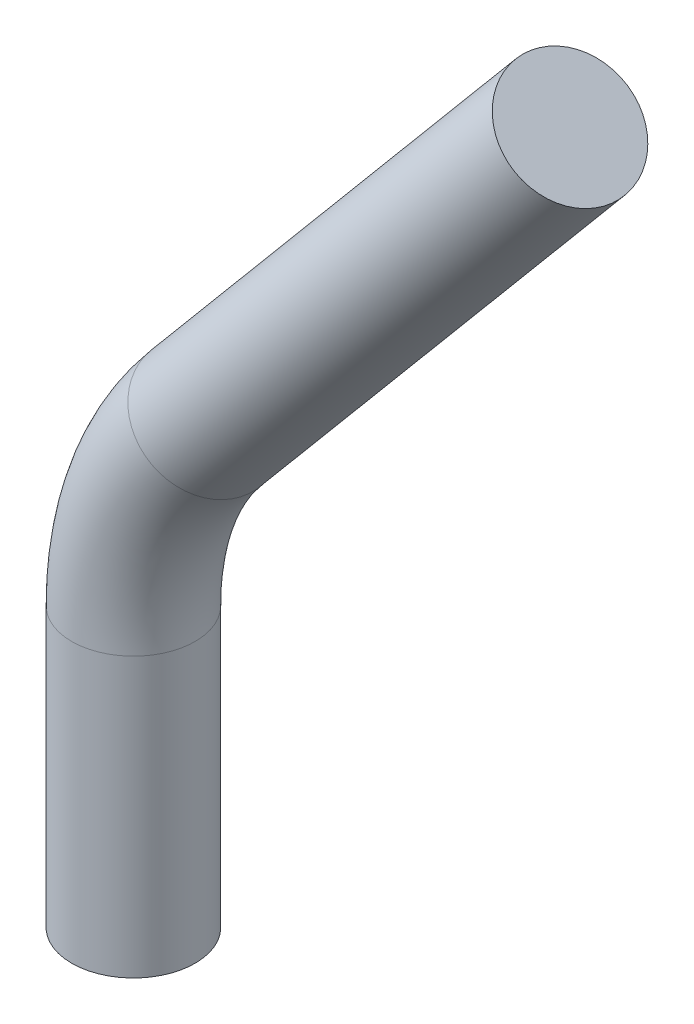
ISO-10303-21;
HEADER;
FILE_DESCRIPTION(('STEP AP214'),'2;1');
FILE_NAME('part.step','',(''),(''),'','','');
FILE_SCHEMA(('AUTOMOTIVE_DESIGN { 1 0 10303 214 1 1 1 1 }'));
ENDSEC;
DATA;
#1=APPLICATION_CONTEXT('core data for automotive mechanical design processes');
#2=APPLICATION_PROTOCOL_DEFINITION('international standard','automotive_design',2000,#1);
#3=PRODUCT_CONTEXT('',#1,'mechanical');
#4=PRODUCT('Part','Part','',(#3));
#5=PRODUCT_RELATED_PRODUCT_CATEGORY('part','',(#4));
#6=PRODUCT_DEFINITION_FORMATION('','',#4);
#7=PRODUCT_DEFINITION_CONTEXT('part definition',#1,'design');
#8=PRODUCT_DEFINITION('design','',#6,#7);
#9=PRODUCT_DEFINITION_SHAPE('','',#8);
#10=(LENGTH_UNIT() NAMED_UNIT(*) SI_UNIT(.MILLI.,.METRE.));
#11=(NAMED_UNIT(*) PLANE_ANGLE_UNIT() SI_UNIT($,.RADIAN.));
#12=(NAMED_UNIT(*) SI_UNIT($,.STERADIAN.) SOLID_ANGLE_UNIT());
#13=UNCERTAINTY_MEASURE_WITH_UNIT(LENGTH_MEASURE(1.E-05),#10,'distance_accuracy_value','');
#14=(GEOMETRIC_REPRESENTATION_CONTEXT(3) GLOBAL_UNCERTAINTY_ASSIGNED_CONTEXT((#13)) GLOBAL_UNIT_ASSIGNED_CONTEXT((#10,
#11,#12)) REPRESENTATION_CONTEXT('',''));
#15=CARTESIAN_POINT('',(0.,0.,0.));
#16=DIRECTION('',(0.,0.,1.));
#17=DIRECTION('',(1.,0.,0.));
#18=AXIS2_PLACEMENT_3D('',#15,#16,#17);
#19=CARTESIAN_POINT('',(0.,0.,0.));
#20=DIRECTION('',(0.,1.,0.));
#21=DIRECTION('',(0.,0.,1.));
#22=AXIS2_PLACEMENT_3D('',#19,#20,#21);
#23=PLANE('',#22);
#24=CARTESIAN_POINT('',(0.,0.,0.));
#25=DIRECTION('',(0.,1.,0.));
#26=DIRECTION('',(0.,0.,1.));
#27=AXIS2_PLACEMENT_3D('',#24,#25,#26);
#28=CIRCLE('',#27,3.);
#29=CARTESIAN_POINT('',(0.,0.,3.));
#30=VERTEX_POINT('',#29);
#31=EDGE_CURVE('E48',#30,#30,#28,.T.);
#32=ORIENTED_EDGE('',*,*,#31,.F.);
#33=EDGE_LOOP('',(#32));
#34=FACE_BOUND('',#33,.T.);
#35=ADVANCED_FACE('F36',(#34),#23,.F.);
#36=CARTESIAN_POINT('',(21.2119911196558,44.2794666229262,0.));
#37=DIRECTION('',(0.64278760968654,0.766044443118977,0.));
#38=DIRECTION('',(0.,0.,1.));
#39=AXIS2_PLACEMENT_3D('',#36,#37,#38);
#40=PLANE('',#39);
#41=CARTESIAN_POINT('',(21.2119911196558,44.2794666229262,0.));
#42=DIRECTION('',(0.64278760968654,0.766044443118977,0.));
#43=DIRECTION('',(0.,0.,1.));
#44=AXIS2_PLACEMENT_3D('',#41,#42,#43);
#45=CIRCLE('',#44,3.);
#46=CARTESIAN_POINT('',(21.2119911196558,44.2794666229262,3.));
#47=VERTEX_POINT('',#46);
#48=EDGE_CURVE('E11',#47,#47,#45,.T.);
#49=ORIENTED_EDGE('',*,*,#48,.T.);
#50=EDGE_LOOP('',(#49));
#51=FACE_BOUND('',#50,.T.);
#52=ADVANCED_FACE('F51',(#51),#40,.T.);
#53=CARTESIAN_POINT('',(0.,0.,0.));
#54=DIRECTION('',(0.,1.,0.));
#55=DIRECTION('',(0.,0.,1.));
#56=AXIS2_PLACEMENT_3D('',#53,#54,#55);
#57=CYLINDRICAL_SURFACE('',#56,3.);
#58=CARTESIAN_POINT('',(0.,13.540446486007,0.));
#59=DIRECTION('',(0.,1.,0.));
#60=DIRECTION('',(0.,0.,1.));
#61=AXIS2_PLACEMENT_3D('',#58,#59,#60);
#62=CIRCLE('',#61,3.);
#63=CARTESIAN_POINT('',(-3.,13.540446486007,0.));
#64=VERTEX_POINT('',#63);
#65=EDGE_CURVE('E61',#64,#64,#62,.T.);
#66=ORIENTED_EDGE('',*,*,#65,.F.);
#67=EDGE_LOOP('',(#66));
#68=FACE_BOUND('',#67,.T.);
#69=ORIENTED_EDGE('',*,*,#31,.T.);
#70=EDGE_LOOP('',(#69));
#71=FACE_BOUND('',#70,.T.);
#72=ADVANCED_FACE('F66',(#68,#71),#57,.T.);
#73=CARTESIAN_POINT('',(15.,13.540446486007,0.));
#74=DIRECTION('',(0.,0.,-1.));
#75=DIRECTION('',(-1.,0.,0.));
#76=AXIS2_PLACEMENT_3D('',#73,#74,#75);
#77=TOROIDAL_SURFACE('',#76,15.,3.);
#78=CARTESIAN_POINT('',(3.50933335321534,23.1822606313051,0.));
#79=DIRECTION('',(0.64278760968654,0.766044443118977,0.));
#80=DIRECTION('',(0.,0.,1.));
#81=AXIS2_PLACEMENT_3D('',#78,#79,#80);
#82=CIRCLE('',#81,3.);
#83=CARTESIAN_POINT('',(1.21120002385841,25.1106234603647,0.));
#84=VERTEX_POINT('',#83);
#85=EDGE_CURVE('E43',#84,#84,#82,.T.);
#86=CARTESIAN_POINT('',(15.,13.540446486007,0.));
#87=DIRECTION('',(0.,0.,-1.));
#88=DIRECTION('',(-1.,0.,0.));
#89=AXIS2_PLACEMENT_3D('',#86,#87,#88);
#90=CIRCLE('',#89,18.);
#91=EDGE_CURVE('',#64,#84,#90,.T.);
#92=ORIENTED_EDGE('',*,*,#65,.T.);
#93=ORIENTED_EDGE('',*,*,#85,.F.);
#94=ORIENTED_EDGE('',*,*,#91,.T.);
#95=ORIENTED_EDGE('',*,*,#91,.F.);
#96=EDGE_LOOP('',(#92,#94,#93,#95));
#97=FACE_BOUND('',#96,.T.);
#98=ADVANCED_FACE('F56',(#97),#77,.T.);
#99=CARTESIAN_POINT('',(3.50933335321534,23.1822606313051,0.));
#100=DIRECTION('',(0.64278760968654,0.766044443118977,0.));
#101=DIRECTION('',(-0.766044443118977,0.64278760968654,0.));
#102=AXIS2_PLACEMENT_3D('',#99,#100,#101);
#103=CYLINDRICAL_SURFACE('',#102,3.);
#104=ORIENTED_EDGE('',*,*,#48,.F.);
#105=EDGE_LOOP('',(#104));
#106=FACE_BOUND('',#105,.T.);
#107=ORIENTED_EDGE('',*,*,#85,.T.);
#108=EDGE_LOOP('',(#107));
#109=FACE_BOUND('',#108,.T.);
#110=ADVANCED_FACE('F53',(#106,#109),#103,.T.);
#111=CLOSED_SHELL('',(#35,#52,#72,#98,#110));
#112=MANIFOLD_SOLID_BREP('B2',#111);
#113=ADVANCED_BREP_SHAPE_REPRESENTATION('',(#18,#112),#14);
#114=SHAPE_DEFINITION_REPRESENTATION(#9,#113);
ENDSEC;
END-ISO-10303-21;
